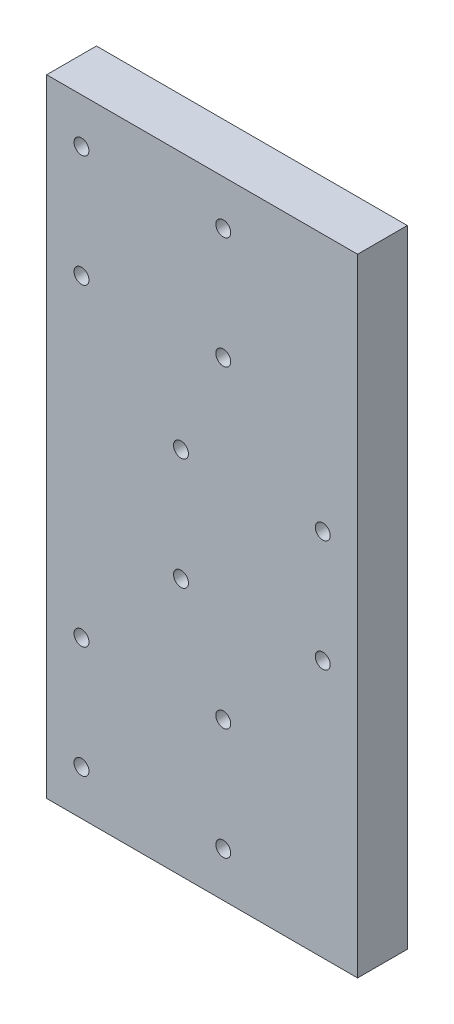
ISO-10303-21;
HEADER;
FILE_DESCRIPTION(('STEP AP214'),'2;1');
FILE_NAME('part.step','',(''),(''),'','','');
FILE_SCHEMA(('AUTOMOTIVE_DESIGN { 1 0 10303 214 1 1 1 1 }'));
ENDSEC;
DATA;
#1=APPLICATION_CONTEXT('core data for automotive mechanical design processes');
#2=APPLICATION_PROTOCOL_DEFINITION('international standard','automotive_design',2000,#1);
#3=PRODUCT_CONTEXT('',#1,'mechanical');
#4=PRODUCT('Part','Part','',(#3));
#5=PRODUCT_RELATED_PRODUCT_CATEGORY('part','',(#4));
#6=PRODUCT_DEFINITION_FORMATION('','',#4);
#7=PRODUCT_DEFINITION_CONTEXT('part definition',#1,'design');
#8=PRODUCT_DEFINITION('design','',#6,#7);
#9=PRODUCT_DEFINITION_SHAPE('','',#8);
#10=(LENGTH_UNIT() NAMED_UNIT(*) SI_UNIT(.MILLI.,.METRE.));
#11=(NAMED_UNIT(*) PLANE_ANGLE_UNIT() SI_UNIT($,.RADIAN.));
#12=(NAMED_UNIT(*) SI_UNIT($,.STERADIAN.) SOLID_ANGLE_UNIT());
#13=UNCERTAINTY_MEASURE_WITH_UNIT(LENGTH_MEASURE(1.E-05),#10,'distance_accuracy_value','');
#14=(GEOMETRIC_REPRESENTATION_CONTEXT(3) GLOBAL_UNCERTAINTY_ASSIGNED_CONTEXT((#13)) GLOBAL_UNIT_ASSIGNED_CONTEXT((#10,
#11,#12)) REPRESENTATION_CONTEXT('',''));
#15=CARTESIAN_POINT('',(0.,0.,0.));
#16=DIRECTION('',(0.,0.,1.));
#17=DIRECTION('',(1.,0.,0.));
#18=AXIS2_PLACEMENT_3D('',#15,#16,#17);
#19=CARTESIAN_POINT('',(-65.,126.,20.));
#20=DIRECTION('',(1.,0.,0.));
#21=DIRECTION('',(0.,1.,0.));
#22=AXIS2_PLACEMENT_3D('',#19,#20,#21);
#23=PLANE('',#22);
#24=DIRECTION('',(0.,-1.,0.));
#25=VECTOR('',#24,1.);
#26=CARTESIAN_POINT('',(-65.,126.,0.));
#27=LINE('',#26,#25);
#28=CARTESIAN_POINT('',(-65.,126.,0.));
#29=VERTEX_POINT('',#28);
#30=CARTESIAN_POINT('',(-65.,-126.,0.));
#31=VERTEX_POINT('',#30);
#32=EDGE_CURVE('E99',#29,#31,#27,.T.);
#33=ORIENTED_EDGE('',*,*,#32,.T.);
#34=DIRECTION('',(0.,0.,-1.));
#35=VECTOR('',#34,1.);
#36=CARTESIAN_POINT('',(-65.,-126.,20.));
#37=LINE('',#36,#35);
#38=CARTESIAN_POINT('',(-65.,-126.,20.));
#39=VERTEX_POINT('',#38);
#40=EDGE_CURVE('E53',#39,#31,#37,.T.);
#41=ORIENTED_EDGE('',*,*,#40,.F.);
#42=DIRECTION('',(0.,-1.,0.));
#43=VECTOR('',#42,1.);
#44=CARTESIAN_POINT('',(-65.,126.,20.));
#45=LINE('',#44,#43);
#46=CARTESIAN_POINT('',(-65.,126.,20.));
#47=VERTEX_POINT('',#46);
#48=EDGE_CURVE('E92',#47,#39,#45,.T.);
#49=ORIENTED_EDGE('',*,*,#48,.F.);
#50=DIRECTION('',(0.,0.,-1.));
#51=VECTOR('',#50,1.);
#52=CARTESIAN_POINT('',(-65.,126.,20.));
#53=LINE('',#52,#51);
#54=EDGE_CURVE('E13',#47,#29,#53,.T.);
#55=ORIENTED_EDGE('',*,*,#54,.T.);
#56=EDGE_LOOP('',(#33,#41,#49,#55));
#57=FACE_BOUND('',#56,.T.);
#58=ADVANCED_FACE('F45',(#57),#23,.F.);
#59=CARTESIAN_POINT('',(60.,-126.,20.));
#60=DIRECTION('',(0.,1.,0.));
#61=DIRECTION('',(0.,0.,1.));
#62=AXIS2_PLACEMENT_3D('',#59,#60,#61);
#63=PLANE('',#62);
#64=DIRECTION('',(1.,0.,0.));
#65=VECTOR('',#64,1.);
#66=CARTESIAN_POINT('',(60.,-126.,0.));
#67=LINE('',#66,#65);
#68=CARTESIAN_POINT('',(60.,-126.,0.));
#69=VERTEX_POINT('',#68);
#70=EDGE_CURVE('E79',#31,#69,#67,.T.);
#71=ORIENTED_EDGE('',*,*,#70,.T.);
#72=DIRECTION('',(0.,0.,-1.));
#73=VECTOR('',#72,1.);
#74=CARTESIAN_POINT('',(60.,-126.,20.));
#75=LINE('',#74,#73);
#76=CARTESIAN_POINT('',(60.,-126.,20.));
#77=VERTEX_POINT('',#76);
#78=EDGE_CURVE('E100',#77,#69,#75,.T.);
#79=ORIENTED_EDGE('',*,*,#78,.F.);
#80=DIRECTION('',(1.,0.,0.));
#81=VECTOR('',#80,1.);
#82=CARTESIAN_POINT('',(60.,-126.,20.));
#83=LINE('',#82,#81);
#84=EDGE_CURVE('E96',#39,#77,#83,.T.);
#85=ORIENTED_EDGE('',*,*,#84,.F.);
#86=ORIENTED_EDGE('',*,*,#40,.T.);
#87=EDGE_LOOP('',(#71,#79,#85,#86));
#88=FACE_BOUND('',#87,.T.);
#89=ADVANCED_FACE('F101',(#88),#63,.F.);
#90=CARTESIAN_POINT('',(60.,126.,20.));
#91=DIRECTION('',(-1.,0.,0.));
#92=DIRECTION('',(0.,0.,1.));
#93=AXIS2_PLACEMENT_3D('',#90,#91,#92);
#94=PLANE('',#93);
#95=DIRECTION('',(0.,1.,0.));
#96=VECTOR('',#95,1.);
#97=CARTESIAN_POINT('',(60.,126.,0.));
#98=LINE('',#97,#96);
#99=CARTESIAN_POINT('',(60.,126.,0.));
#100=VERTEX_POINT('',#99);
#101=EDGE_CURVE('E86',#69,#100,#98,.T.);
#102=ORIENTED_EDGE('',*,*,#101,.T.);
#103=DIRECTION('',(0.,0.,-1.));
#104=VECTOR('',#103,1.);
#105=CARTESIAN_POINT('',(60.,126.,20.));
#106=LINE('',#105,#104);
#107=CARTESIAN_POINT('',(60.,126.,20.));
#108=VERTEX_POINT('',#107);
#109=EDGE_CURVE('E105',#108,#100,#106,.T.);
#110=ORIENTED_EDGE('',*,*,#109,.F.);
#111=DIRECTION('',(0.,1.,0.));
#112=VECTOR('',#111,1.);
#113=CARTESIAN_POINT('',(60.,126.,20.));
#114=LINE('',#113,#112);
#115=EDGE_CURVE('E103',#77,#108,#114,.T.);
#116=ORIENTED_EDGE('',*,*,#115,.F.);
#117=ORIENTED_EDGE('',*,*,#78,.T.);
#118=EDGE_LOOP('',(#102,#110,#116,#117));
#119=FACE_BOUND('',#118,.T.);
#120=ADVANCED_FACE('F116',(#119),#94,.F.);
#121=CARTESIAN_POINT('',(60.,126.,20.));
#122=DIRECTION('',(0.,-1.,0.));
#123=DIRECTION('',(1.,0.,0.));
#124=AXIS2_PLACEMENT_3D('',#121,#122,#123);
#125=PLANE('',#124);
#126=DIRECTION('',(-1.,0.,0.));
#127=VECTOR('',#126,1.);
#128=CARTESIAN_POINT('',(60.,126.,0.));
#129=LINE('',#128,#127);
#130=EDGE_CURVE('E113',#100,#29,#129,.T.);
#131=ORIENTED_EDGE('',*,*,#130,.T.);
#132=ORIENTED_EDGE('',*,*,#54,.F.);
#133=DIRECTION('',(-1.,0.,0.));
#134=VECTOR('',#133,1.);
#135=CARTESIAN_POINT('',(-60.,126.,20.));
#136=LINE('',#135,#134);
#137=EDGE_CURVE('E61',#108,#47,#136,.T.);
#138=ORIENTED_EDGE('',*,*,#137,.F.);
#139=ORIENTED_EDGE('',*,*,#109,.T.);
#140=EDGE_LOOP('',(#131,#132,#138,#139));
#141=FACE_BOUND('',#140,.T.);
#142=ADVANCED_FACE('F120',(#141),#125,.F.);
#143=CARTESIAN_POINT('',(0.,0.,20.));
#144=DIRECTION('',(0.,0.,1.));
#145=DIRECTION('',(1.,0.,0.));
#146=AXIS2_PLACEMENT_3D('',#143,#144,#145);
#147=PLANE('',#146);
#148=CARTESIAN_POINT('',(-51.0000000001381,-108.000000000002,20.));
#149=DIRECTION('',(0.,0.,-1.));
#150=DIRECTION('',(-1.,0.,0.));
#151=AXIS2_PLACEMENT_3D('',#148,#149,#150);
#152=CIRCLE('',#151,3.);
#153=CARTESIAN_POINT('',(-54.0000000001381,-108.000000000002,20.));
#154=VERTEX_POINT('',#153);
#155=EDGE_CURVE('E287',#154,#154,#152,.T.);
#156=ORIENTED_EDGE('',*,*,#155,.T.);
#157=EDGE_LOOP('',(#156));
#158=FACE_BOUND('',#157,.T.);
#159=CARTESIAN_POINT('',(-51.0000000001168,-63.0000000000024,20.));
#160=DIRECTION('',(0.,0.,-1.));
#161=DIRECTION('',(-1.,0.,0.));
#162=AXIS2_PLACEMENT_3D('',#159,#160,#161);
#163=CIRCLE('',#162,3.);
#164=CARTESIAN_POINT('',(-54.0000000001168,-63.0000000000024,20.));
#165=VERTEX_POINT('',#164);
#166=EDGE_CURVE('E295',#165,#165,#163,.T.);
#167=ORIENTED_EDGE('',*,*,#166,.T.);
#168=EDGE_LOOP('',(#167));
#169=FACE_BOUND('',#168,.T.);
#170=CARTESIAN_POINT('',(5.99999999986208,-108.000000000029,20.));
#171=DIRECTION('',(0.,0.,-1.));
#172=DIRECTION('',(-1.,0.,0.));
#173=AXIS2_PLACEMENT_3D('',#170,#171,#172);
#174=CIRCLE('',#173,3.);
#175=CARTESIAN_POINT('',(2.99999999986207,-108.000000000029,20.));
#176=VERTEX_POINT('',#175);
#177=EDGE_CURVE('E301',#176,#176,#174,.T.);
#178=ORIENTED_EDGE('',*,*,#177,.T.);
#179=EDGE_LOOP('',(#178));
#180=FACE_BOUND('',#179,.T.);
#181=CARTESIAN_POINT('',(5.99999999988317,-63.0000000000281,20.));
#182=DIRECTION('',(0.,0.,-1.));
#183=DIRECTION('',(-1.,0.,0.));
#184=AXIS2_PLACEMENT_3D('',#181,#182,#183);
#185=CIRCLE('',#184,3.);
#186=CARTESIAN_POINT('',(2.99999999988317,-63.0000000000281,20.));
#187=VERTEX_POINT('',#186);
#188=EDGE_CURVE('E307',#187,#187,#185,.T.);
#189=ORIENTED_EDGE('',*,*,#188,.T.);
#190=EDGE_LOOP('',(#189));
#191=FACE_BOUND('',#190,.T.);
#192=CARTESIAN_POINT('',(45.999999998693,-22.5000000007438,20.));
#193=DIRECTION('',(0.,0.,-1.));
#194=DIRECTION('',(-1.,0.,0.));
#195=AXIS2_PLACEMENT_3D('',#192,#193,#194);
#196=CIRCLE('',#195,2.99999999999999);
#197=CARTESIAN_POINT('',(42.999999998693,-22.5000000007438,20.));
#198=VERTEX_POINT('',#197);
#199=EDGE_CURVE('E313',#198,#198,#196,.T.);
#200=ORIENTED_EDGE('',*,*,#199,.T.);
#201=EDGE_LOOP('',(#200));
#202=FACE_BOUND('',#201,.T.);
#203=CARTESIAN_POINT('',(45.9999999986925,22.4999999992561,20.));
#204=DIRECTION('',(0.,0.,-1.));
#205=DIRECTION('',(-1.,0.,0.));
#206=AXIS2_PLACEMENT_3D('',#203,#204,#205);
#207=CIRCLE('',#206,2.99999999999999);
#208=CARTESIAN_POINT('',(42.9999999986925,22.4999999992561,20.));
#209=VERTEX_POINT('',#208);
#210=EDGE_CURVE('E319',#209,#209,#207,.T.);
#211=ORIENTED_EDGE('',*,*,#210,.T.);
#212=EDGE_LOOP('',(#211));
#213=FACE_BOUND('',#212,.T.);
#214=CARTESIAN_POINT('',(-11.0000000013072,-22.5000000007447,20.));
#215=DIRECTION('',(0.,0.,-1.));
#216=DIRECTION('',(-1.,0.,0.));
#217=AXIS2_PLACEMENT_3D('',#214,#215,#216);
#218=CIRCLE('',#217,3.);
#219=CARTESIAN_POINT('',(-14.0000000013072,-22.5000000007447,20.));
#220=VERTEX_POINT('',#219);
#221=EDGE_CURVE('E325',#220,#220,#218,.T.);
#222=ORIENTED_EDGE('',*,*,#221,.T.);
#223=EDGE_LOOP('',(#222));
#224=FACE_BOUND('',#223,.T.);
#225=CARTESIAN_POINT('',(-11.0000000013074,22.4999999992548,20.));
#226=DIRECTION('',(0.,0.,-1.));
#227=DIRECTION('',(-1.,0.,0.));
#228=AXIS2_PLACEMENT_3D('',#225,#226,#227);
#229=CIRCLE('',#228,3.);
#230=CARTESIAN_POINT('',(-14.0000000013074,22.4999999992548,20.));
#231=VERTEX_POINT('',#230);
#232=EDGE_CURVE('E331',#231,#231,#229,.T.);
#233=ORIENTED_EDGE('',*,*,#232,.T.);
#234=EDGE_LOOP('',(#233));
#235=FACE_BOUND('',#234,.T.);
#236=CARTESIAN_POINT('',(5.99999999994046,63.0000000000287,20.));
#237=DIRECTION('',(0.,0.,-1.));
#238=DIRECTION('',(-1.,0.,0.));
#239=AXIS2_PLACEMENT_3D('',#236,#237,#238);
#240=CIRCLE('',#239,3.);
#241=CARTESIAN_POINT('',(2.99999999994046,63.0000000000287,20.));
#242=VERTEX_POINT('',#241);
#243=EDGE_CURVE('E337',#242,#242,#240,.T.);
#244=ORIENTED_EDGE('',*,*,#243,.T.);
#245=EDGE_LOOP('',(#244));
#246=FACE_BOUND('',#245,.T.);
#247=CARTESIAN_POINT('',(5.99999999996133,108.000000000029,20.));
#248=DIRECTION('',(0.,0.,-1.));
#249=DIRECTION('',(-1.,0.,0.));
#250=AXIS2_PLACEMENT_3D('',#247,#248,#249);
#251=CIRCLE('',#250,3.);
#252=CARTESIAN_POINT('',(2.99999999996133,108.000000000029,20.));
#253=VERTEX_POINT('',#252);
#254=EDGE_CURVE('E343',#253,#253,#251,.T.);
#255=ORIENTED_EDGE('',*,*,#254,.T.);
#256=EDGE_LOOP('',(#255));
#257=FACE_BOUND('',#256,.T.);
#258=CARTESIAN_POINT('',(-51.0000000000597,63.0000000000549,20.));
#259=DIRECTION('',(0.,0.,-1.));
#260=DIRECTION('',(-1.,0.,0.));
#261=AXIS2_PLACEMENT_3D('',#258,#259,#260);
#262=CIRCLE('',#261,3.);
#263=CARTESIAN_POINT('',(-54.0000000000597,63.0000000000549,20.));
#264=VERTEX_POINT('',#263);
#265=EDGE_CURVE('E349',#264,#264,#262,.T.);
#266=ORIENTED_EDGE('',*,*,#265,.T.);
#267=EDGE_LOOP('',(#266));
#268=FACE_BOUND('',#267,.T.);
#269=CARTESIAN_POINT('',(-51.0000000000386,108.000000000054,20.));
#270=DIRECTION('',(0.,0.,-1.));
#271=DIRECTION('',(-1.,0.,0.));
#272=AXIS2_PLACEMENT_3D('',#269,#270,#271);
#273=CIRCLE('',#272,3.);
#274=CARTESIAN_POINT('',(-54.0000000000386,108.000000000054,20.));
#275=VERTEX_POINT('',#274);
#276=EDGE_CURVE('E110',#275,#275,#273,.T.);
#277=ORIENTED_EDGE('',*,*,#276,.T.);
#278=EDGE_LOOP('',(#277));
#279=FACE_BOUND('',#278,.T.);
#280=ORIENTED_EDGE('',*,*,#137,.T.);
#281=ORIENTED_EDGE('',*,*,#48,.T.);
#282=ORIENTED_EDGE('',*,*,#84,.T.);
#283=ORIENTED_EDGE('',*,*,#115,.T.);
#284=EDGE_LOOP('',(#280,#281,#282,#283));
#285=FACE_BOUND('',#284,.T.);
#286=ADVANCED_FACE('F94',(#158,#169,#180,#191,#202,#213,#224,#235,#246,#257,#268,#279,#285),
#147,.T.);
#287=CARTESIAN_POINT('',(0.,0.,0.));
#288=DIRECTION('',(0.,0.,1.));
#289=DIRECTION('',(1.,0.,0.));
#290=AXIS2_PLACEMENT_3D('',#287,#288,#289);
#291=PLANE('',#290);
#292=CARTESIAN_POINT('',(-51.0000000001381,-108.000000000002,0.));
#293=DIRECTION('',(0.,0.,-1.));
#294=DIRECTION('',(-1.,0.,0.));
#295=AXIS2_PLACEMENT_3D('',#292,#293,#294);
#296=CIRCLE('',#295,3.);
#297=CARTESIAN_POINT('',(-54.0000000001381,-108.000000000002,0.));
#298=VERTEX_POINT('',#297);
#299=EDGE_CURVE('E290',#298,#298,#296,.T.);
#300=ORIENTED_EDGE('',*,*,#299,.F.);
#301=EDGE_LOOP('',(#300));
#302=FACE_BOUND('',#301,.T.);
#303=CARTESIAN_POINT('',(-51.0000000001168,-63.0000000000024,0.));
#304=DIRECTION('',(0.,0.,-1.));
#305=DIRECTION('',(-1.,0.,0.));
#306=AXIS2_PLACEMENT_3D('',#303,#304,#305);
#307=CIRCLE('',#306,3.);
#308=CARTESIAN_POINT('',(-54.0000000001168,-63.0000000000024,0.));
#309=VERTEX_POINT('',#308);
#310=EDGE_CURVE('E292',#309,#309,#307,.T.);
#311=ORIENTED_EDGE('',*,*,#310,.F.);
#312=EDGE_LOOP('',(#311));
#313=FACE_BOUND('',#312,.T.);
#314=CARTESIAN_POINT('',(5.99999999986208,-108.000000000029,0.));
#315=DIRECTION('',(0.,0.,-1.));
#316=DIRECTION('',(-1.,0.,0.));
#317=AXIS2_PLACEMENT_3D('',#314,#315,#316);
#318=CIRCLE('',#317,3.);
#319=CARTESIAN_POINT('',(2.99999999986207,-108.000000000029,0.));
#320=VERTEX_POINT('',#319);
#321=EDGE_CURVE('E298',#320,#320,#318,.T.);
#322=ORIENTED_EDGE('',*,*,#321,.F.);
#323=EDGE_LOOP('',(#322));
#324=FACE_BOUND('',#323,.T.);
#325=CARTESIAN_POINT('',(5.99999999988317,-63.0000000000281,0.));
#326=DIRECTION('',(0.,0.,-1.));
#327=DIRECTION('',(-1.,0.,0.));
#328=AXIS2_PLACEMENT_3D('',#325,#326,#327);
#329=CIRCLE('',#328,3.);
#330=CARTESIAN_POINT('',(2.99999999988317,-63.0000000000281,0.));
#331=VERTEX_POINT('',#330);
#332=EDGE_CURVE('E304',#331,#331,#329,.T.);
#333=ORIENTED_EDGE('',*,*,#332,.F.);
#334=EDGE_LOOP('',(#333));
#335=FACE_BOUND('',#334,.T.);
#336=CARTESIAN_POINT('',(45.999999998693,-22.5000000007438,0.));
#337=DIRECTION('',(0.,0.,-1.));
#338=DIRECTION('',(-1.,0.,0.));
#339=AXIS2_PLACEMENT_3D('',#336,#337,#338);
#340=CIRCLE('',#339,2.99999999999999);
#341=CARTESIAN_POINT('',(42.999999998693,-22.5000000007438,0.));
#342=VERTEX_POINT('',#341);
#343=EDGE_CURVE('E310',#342,#342,#340,.T.);
#344=ORIENTED_EDGE('',*,*,#343,.F.);
#345=EDGE_LOOP('',(#344));
#346=FACE_BOUND('',#345,.T.);
#347=CARTESIAN_POINT('',(45.9999999986925,22.4999999992561,0.));
#348=DIRECTION('',(0.,0.,-1.));
#349=DIRECTION('',(-1.,0.,0.));
#350=AXIS2_PLACEMENT_3D('',#347,#348,#349);
#351=CIRCLE('',#350,2.99999999999999);
#352=CARTESIAN_POINT('',(42.9999999986925,22.4999999992561,0.));
#353=VERTEX_POINT('',#352);
#354=EDGE_CURVE('E316',#353,#353,#351,.T.);
#355=ORIENTED_EDGE('',*,*,#354,.F.);
#356=EDGE_LOOP('',(#355));
#357=FACE_BOUND('',#356,.T.);
#358=CARTESIAN_POINT('',(-11.0000000013072,-22.5000000007447,0.));
#359=DIRECTION('',(0.,0.,-1.));
#360=DIRECTION('',(-1.,0.,0.));
#361=AXIS2_PLACEMENT_3D('',#358,#359,#360);
#362=CIRCLE('',#361,3.);
#363=CARTESIAN_POINT('',(-14.0000000013072,-22.5000000007447,0.));
#364=VERTEX_POINT('',#363);
#365=EDGE_CURVE('E322',#364,#364,#362,.T.);
#366=ORIENTED_EDGE('',*,*,#365,.F.);
#367=EDGE_LOOP('',(#366));
#368=FACE_BOUND('',#367,.T.);
#369=CARTESIAN_POINT('',(-11.0000000013074,22.4999999992548,0.));
#370=DIRECTION('',(0.,0.,-1.));
#371=DIRECTION('',(-1.,0.,0.));
#372=AXIS2_PLACEMENT_3D('',#369,#370,#371);
#373=CIRCLE('',#372,3.);
#374=CARTESIAN_POINT('',(-14.0000000013074,22.4999999992548,0.));
#375=VERTEX_POINT('',#374);
#376=EDGE_CURVE('E328',#375,#375,#373,.T.);
#377=ORIENTED_EDGE('',*,*,#376,.F.);
#378=EDGE_LOOP('',(#377));
#379=FACE_BOUND('',#378,.T.);
#380=CARTESIAN_POINT('',(5.99999999994046,63.0000000000287,0.));
#381=DIRECTION('',(0.,0.,-1.));
#382=DIRECTION('',(-1.,0.,0.));
#383=AXIS2_PLACEMENT_3D('',#380,#381,#382);
#384=CIRCLE('',#383,3.);
#385=CARTESIAN_POINT('',(2.99999999994046,63.0000000000287,0.));
#386=VERTEX_POINT('',#385);
#387=EDGE_CURVE('E334',#386,#386,#384,.T.);
#388=ORIENTED_EDGE('',*,*,#387,.F.);
#389=EDGE_LOOP('',(#388));
#390=FACE_BOUND('',#389,.T.);
#391=CARTESIAN_POINT('',(5.99999999996133,108.000000000029,0.));
#392=DIRECTION('',(0.,0.,-1.));
#393=DIRECTION('',(-1.,0.,0.));
#394=AXIS2_PLACEMENT_3D('',#391,#392,#393);
#395=CIRCLE('',#394,3.);
#396=CARTESIAN_POINT('',(2.99999999996133,108.000000000029,0.));
#397=VERTEX_POINT('',#396);
#398=EDGE_CURVE('E340',#397,#397,#395,.T.);
#399=ORIENTED_EDGE('',*,*,#398,.F.);
#400=EDGE_LOOP('',(#399));
#401=FACE_BOUND('',#400,.T.);
#402=CARTESIAN_POINT('',(-51.0000000000597,63.0000000000549,0.));
#403=DIRECTION('',(0.,0.,-1.));
#404=DIRECTION('',(-1.,0.,0.));
#405=AXIS2_PLACEMENT_3D('',#402,#403,#404);
#406=CIRCLE('',#405,3.);
#407=CARTESIAN_POINT('',(-54.0000000000597,63.0000000000549,0.));
#408=VERTEX_POINT('',#407);
#409=EDGE_CURVE('E346',#408,#408,#406,.T.);
#410=ORIENTED_EDGE('',*,*,#409,.F.);
#411=EDGE_LOOP('',(#410));
#412=FACE_BOUND('',#411,.T.);
#413=CARTESIAN_POINT('',(-51.0000000000386,108.000000000054,0.));
#414=DIRECTION('',(0.,0.,-1.));
#415=DIRECTION('',(-1.,0.,0.));
#416=AXIS2_PLACEMENT_3D('',#413,#414,#415);
#417=CIRCLE('',#416,3.);
#418=CARTESIAN_POINT('',(-54.0000000000386,108.000000000054,0.));
#419=VERTEX_POINT('',#418);
#420=EDGE_CURVE('E352',#419,#419,#417,.T.);
#421=ORIENTED_EDGE('',*,*,#420,.F.);
#422=EDGE_LOOP('',(#421));
#423=FACE_BOUND('',#422,.T.);
#424=ORIENTED_EDGE('',*,*,#32,.F.);
#425=ORIENTED_EDGE('',*,*,#130,.F.);
#426=ORIENTED_EDGE('',*,*,#101,.F.);
#427=ORIENTED_EDGE('',*,*,#70,.F.);
#428=EDGE_LOOP('',(#424,#425,#426,#427));
#429=FACE_BOUND('',#428,.T.);
#430=ADVANCED_FACE('F119',(#302,#313,#324,#335,#346,#357,#368,#379,#390,#401,#412,#423,#429),
#291,.F.);
#431=CARTESIAN_POINT('',(-51.0000000000386,108.000000000054,20.));
#432=DIRECTION('',(0.,0.,-1.));
#433=DIRECTION('',(-1.,0.,0.));
#434=AXIS2_PLACEMENT_3D('',#431,#432,#433);
#435=CYLINDRICAL_SURFACE('',#434,3.);
#436=ORIENTED_EDGE('',*,*,#276,.F.);
#437=EDGE_LOOP('',(#436));
#438=FACE_BOUND('',#437,.T.);
#439=ORIENTED_EDGE('',*,*,#420,.T.);
#440=EDGE_LOOP('',(#439));
#441=FACE_BOUND('',#440,.T.);
#442=ADVANCED_FACE('F161',(#438,#441),#435,.F.);
#443=CARTESIAN_POINT('',(-51.0000000000597,63.0000000000549,20.));
#444=DIRECTION('',(0.,0.,-1.));
#445=DIRECTION('',(-1.,0.,0.));
#446=AXIS2_PLACEMENT_3D('',#443,#444,#445);
#447=CYLINDRICAL_SURFACE('',#446,3.);
#448=ORIENTED_EDGE('',*,*,#265,.F.);
#449=EDGE_LOOP('',(#448));
#450=FACE_BOUND('',#449,.T.);
#451=ORIENTED_EDGE('',*,*,#409,.T.);
#452=EDGE_LOOP('',(#451));
#453=FACE_BOUND('',#452,.T.);
#454=ADVANCED_FACE('F170',(#450,#453),#447,.F.);
#455=CARTESIAN_POINT('',(5.99999999996133,108.000000000029,20.));
#456=DIRECTION('',(0.,0.,-1.));
#457=DIRECTION('',(-1.,0.,0.));
#458=AXIS2_PLACEMENT_3D('',#455,#456,#457);
#459=CYLINDRICAL_SURFACE('',#458,3.);
#460=ORIENTED_EDGE('',*,*,#254,.F.);
#461=EDGE_LOOP('',(#460));
#462=FACE_BOUND('',#461,.T.);
#463=ORIENTED_EDGE('',*,*,#398,.T.);
#464=EDGE_LOOP('',(#463));
#465=FACE_BOUND('',#464,.T.);
#466=ADVANCED_FACE('F180',(#462,#465),#459,.F.);
#467=CARTESIAN_POINT('',(5.99999999994046,63.0000000000287,20.));
#468=DIRECTION('',(0.,0.,-1.));
#469=DIRECTION('',(-1.,0.,0.));
#470=AXIS2_PLACEMENT_3D('',#467,#468,#469);
#471=CYLINDRICAL_SURFACE('',#470,3.);
#472=ORIENTED_EDGE('',*,*,#243,.F.);
#473=EDGE_LOOP('',(#472));
#474=FACE_BOUND('',#473,.T.);
#475=ORIENTED_EDGE('',*,*,#387,.T.);
#476=EDGE_LOOP('',(#475));
#477=FACE_BOUND('',#476,.T.);
#478=ADVANCED_FACE('F190',(#474,#477),#471,.F.);
#479=CARTESIAN_POINT('',(-11.0000000013074,22.4999999992548,20.));
#480=DIRECTION('',(0.,0.,-1.));
#481=DIRECTION('',(-1.,0.,0.));
#482=AXIS2_PLACEMENT_3D('',#479,#480,#481);
#483=CYLINDRICAL_SURFACE('',#482,3.);
#484=ORIENTED_EDGE('',*,*,#232,.F.);
#485=EDGE_LOOP('',(#484));
#486=FACE_BOUND('',#485,.T.);
#487=ORIENTED_EDGE('',*,*,#376,.T.);
#488=EDGE_LOOP('',(#487));
#489=FACE_BOUND('',#488,.T.);
#490=ADVANCED_FACE('F200',(#486,#489),#483,.F.);
#491=CARTESIAN_POINT('',(-11.0000000013072,-22.5000000007447,20.));
#492=DIRECTION('',(0.,0.,-1.));
#493=DIRECTION('',(-1.,0.,0.));
#494=AXIS2_PLACEMENT_3D('',#491,#492,#493);
#495=CYLINDRICAL_SURFACE('',#494,3.);
#496=ORIENTED_EDGE('',*,*,#221,.F.);
#497=EDGE_LOOP('',(#496));
#498=FACE_BOUND('',#497,.T.);
#499=ORIENTED_EDGE('',*,*,#365,.T.);
#500=EDGE_LOOP('',(#499));
#501=FACE_BOUND('',#500,.T.);
#502=ADVANCED_FACE('F210',(#498,#501),#495,.F.);
#503=CARTESIAN_POINT('',(45.9999999986925,22.4999999992561,20.));
#504=DIRECTION('',(0.,0.,-1.));
#505=DIRECTION('',(-1.,0.,0.));
#506=AXIS2_PLACEMENT_3D('',#503,#504,#505);
#507=CYLINDRICAL_SURFACE('',#506,2.99999999999999);
#508=ORIENTED_EDGE('',*,*,#210,.F.);
#509=EDGE_LOOP('',(#508));
#510=FACE_BOUND('',#509,.T.);
#511=ORIENTED_EDGE('',*,*,#354,.T.);
#512=EDGE_LOOP('',(#511));
#513=FACE_BOUND('',#512,.T.);
#514=ADVANCED_FACE('F220',(#510,#513),#507,.F.);
#515=CARTESIAN_POINT('',(45.999999998693,-22.5000000007438,20.));
#516=DIRECTION('',(0.,0.,-1.));
#517=DIRECTION('',(-1.,0.,0.));
#518=AXIS2_PLACEMENT_3D('',#515,#516,#517);
#519=CYLINDRICAL_SURFACE('',#518,2.99999999999999);
#520=ORIENTED_EDGE('',*,*,#199,.F.);
#521=EDGE_LOOP('',(#520));
#522=FACE_BOUND('',#521,.T.);
#523=ORIENTED_EDGE('',*,*,#343,.T.);
#524=EDGE_LOOP('',(#523));
#525=FACE_BOUND('',#524,.T.);
#526=ADVANCED_FACE('F230',(#522,#525),#519,.F.);
#527=CARTESIAN_POINT('',(5.99999999988317,-63.0000000000281,20.));
#528=DIRECTION('',(0.,0.,-1.));
#529=DIRECTION('',(-1.,0.,0.));
#530=AXIS2_PLACEMENT_3D('',#527,#528,#529);
#531=CYLINDRICAL_SURFACE('',#530,3.);
#532=ORIENTED_EDGE('',*,*,#188,.F.);
#533=EDGE_LOOP('',(#532));
#534=FACE_BOUND('',#533,.T.);
#535=ORIENTED_EDGE('',*,*,#332,.T.);
#536=EDGE_LOOP('',(#535));
#537=FACE_BOUND('',#536,.T.);
#538=ADVANCED_FACE('F240',(#534,#537),#531,.F.);
#539=CARTESIAN_POINT('',(5.99999999986208,-108.000000000029,20.));
#540=DIRECTION('',(0.,0.,-1.));
#541=DIRECTION('',(-1.,0.,0.));
#542=AXIS2_PLACEMENT_3D('',#539,#540,#541);
#543=CYLINDRICAL_SURFACE('',#542,3.);
#544=ORIENTED_EDGE('',*,*,#177,.F.);
#545=EDGE_LOOP('',(#544));
#546=FACE_BOUND('',#545,.T.);
#547=ORIENTED_EDGE('',*,*,#321,.T.);
#548=EDGE_LOOP('',(#547));
#549=FACE_BOUND('',#548,.T.);
#550=ADVANCED_FACE('F250',(#546,#549),#543,.F.);
#551=CARTESIAN_POINT('',(-51.0000000001168,-63.0000000000024,20.));
#552=DIRECTION('',(0.,0.,-1.));
#553=DIRECTION('',(-1.,0.,0.));
#554=AXIS2_PLACEMENT_3D('',#551,#552,#553);
#555=CYLINDRICAL_SURFACE('',#554,3.);
#556=ORIENTED_EDGE('',*,*,#166,.F.);
#557=EDGE_LOOP('',(#556));
#558=FACE_BOUND('',#557,.T.);
#559=ORIENTED_EDGE('',*,*,#310,.T.);
#560=EDGE_LOOP('',(#559));
#561=FACE_BOUND('',#560,.T.);
#562=ADVANCED_FACE('F260',(#558,#561),#555,.F.);
#563=CARTESIAN_POINT('',(-51.0000000001381,-108.000000000002,20.));
#564=DIRECTION('',(0.,0.,-1.));
#565=DIRECTION('',(-1.,0.,0.));
#566=AXIS2_PLACEMENT_3D('',#563,#564,#565);
#567=CYLINDRICAL_SURFACE('',#566,3.);
#568=ORIENTED_EDGE('',*,*,#155,.F.);
#569=EDGE_LOOP('',(#568));
#570=FACE_BOUND('',#569,.T.);
#571=ORIENTED_EDGE('',*,*,#299,.T.);
#572=EDGE_LOOP('',(#571));
#573=FACE_BOUND('',#572,.T.);
#574=ADVANCED_FACE('F270',(#570,#573),#567,.F.);
#575=CLOSED_SHELL('',(#58,#89,#120,#142,#286,#430,#442,#454,#466,#478,#490,#502,#514,#526,#538,
#550,#562,#574));
#576=MANIFOLD_SOLID_BREP('B2',#575);
#577=ADVANCED_BREP_SHAPE_REPRESENTATION('',(#18,#576),#14);
#578=SHAPE_DEFINITION_REPRESENTATION(#9,#577);
ENDSEC;
END-ISO-10303-21;
